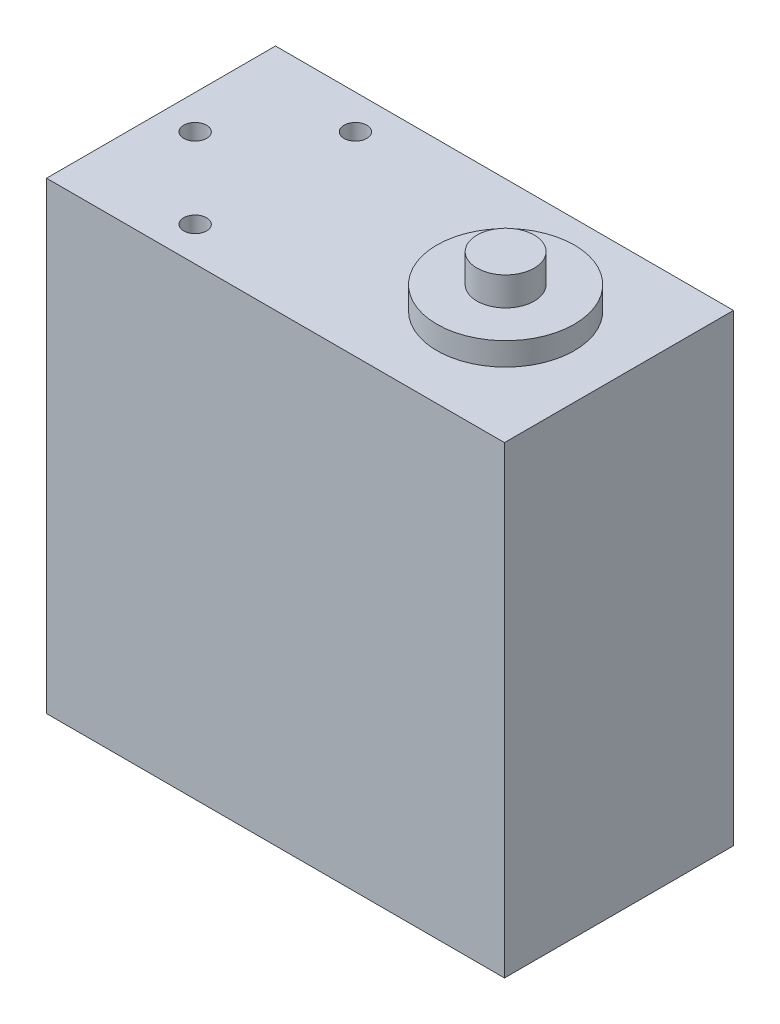
ISO-10303-21;
HEADER;
FILE_DESCRIPTION(('STEP AP214'),'2;1');
FILE_NAME('part.step','',(''),(''),'','','');
FILE_SCHEMA(('AUTOMOTIVE_DESIGN { 1 0 10303 214 1 1 1 1 }'));
ENDSEC;
DATA;
#1=APPLICATION_CONTEXT('core data for automotive mechanical design processes');
#2=APPLICATION_PROTOCOL_DEFINITION('international standard','automotive_design',2000,#1);
#3=PRODUCT_CONTEXT('',#1,'mechanical');
#4=PRODUCT('Part','Part','',(#3));
#5=PRODUCT_RELATED_PRODUCT_CATEGORY('part','',(#4));
#6=PRODUCT_DEFINITION_FORMATION('','',#4);
#7=PRODUCT_DEFINITION_CONTEXT('part definition',#1,'design');
#8=PRODUCT_DEFINITION('design','',#6,#7);
#9=PRODUCT_DEFINITION_SHAPE('','',#8);
#10=(LENGTH_UNIT() NAMED_UNIT(*) SI_UNIT(.MILLI.,.METRE.));
#11=(NAMED_UNIT(*) PLANE_ANGLE_UNIT() SI_UNIT($,.RADIAN.));
#12=(NAMED_UNIT(*) SI_UNIT($,.STERADIAN.) SOLID_ANGLE_UNIT());
#13=UNCERTAINTY_MEASURE_WITH_UNIT(LENGTH_MEASURE(1.E-05),#10,'distance_accuracy_value','');
#14=(GEOMETRIC_REPRESENTATION_CONTEXT(3) GLOBAL_UNCERTAINTY_ASSIGNED_CONTEXT((#13)) GLOBAL_UNIT_ASSIGNED_CONTEXT((#10,
#11,#12)) REPRESENTATION_CONTEXT('',''));
#15=CARTESIAN_POINT('',(0.,0.,0.));
#16=DIRECTION('',(0.,0.,1.));
#17=DIRECTION('',(1.,0.,0.));
#18=AXIS2_PLACEMENT_3D('',#15,#16,#17);
#19=CARTESIAN_POINT('',(0.,0.,20.));
#20=DIRECTION('',(1.,0.,0.));
#21=DIRECTION('',(0.,0.,-1.));
#22=AXIS2_PLACEMENT_3D('',#19,#20,#21);
#23=PLANE('',#22);
#24=DIRECTION('',(0.,-1.,0.));
#25=VECTOR('',#24,1.);
#26=CARTESIAN_POINT('',(0.,0.,0.));
#27=LINE('',#26,#25);
#28=CARTESIAN_POINT('',(0.,40.5,0.));
#29=VERTEX_POINT('',#28);
#30=CARTESIAN_POINT('',(0.,0.,0.));
#31=VERTEX_POINT('',#30);
#32=EDGE_CURVE('E113',#29,#31,#27,.T.);
#33=ORIENTED_EDGE('',*,*,#32,.T.);
#34=DIRECTION('',(0.,0.,-1.));
#35=VECTOR('',#34,1.);
#36=CARTESIAN_POINT('',(0.,0.,20.));
#37=LINE('',#36,#35);
#38=CARTESIAN_POINT('',(0.,0.,20.));
#39=VERTEX_POINT('',#38);
#40=EDGE_CURVE('E51',#39,#31,#37,.T.);
#41=ORIENTED_EDGE('',*,*,#40,.F.);
#42=DIRECTION('',(0.,-1.,0.));
#43=VECTOR('',#42,1.);
#44=CARTESIAN_POINT('',(0.,0.,20.));
#45=LINE('',#44,#43);
#46=CARTESIAN_POINT('',(0.,40.5,20.));
#47=VERTEX_POINT('',#46);
#48=EDGE_CURVE('E95',#47,#39,#45,.T.);
#49=ORIENTED_EDGE('',*,*,#48,.F.);
#50=DIRECTION('',(0.,0.,-1.));
#51=VECTOR('',#50,1.);
#52=CARTESIAN_POINT('',(0.,40.5,20.));
#53=LINE('',#52,#51);
#54=EDGE_CURVE('E109',#47,#29,#53,.T.);
#55=ORIENTED_EDGE('',*,*,#54,.T.);
#56=EDGE_LOOP('',(#33,#41,#49,#55));
#57=FACE_BOUND('',#56,.T.);
#58=ADVANCED_FACE('F42',(#57),#23,.F.);
#59=CARTESIAN_POINT('',(0.,0.,20.));
#60=DIRECTION('',(0.,1.,0.));
#61=DIRECTION('',(0.,0.,1.));
#62=AXIS2_PLACEMENT_3D('',#59,#60,#61);
#63=PLANE('',#62);
#64=CARTESIAN_POINT('',(17.5,0.,17.5));
#65=DIRECTION('',(0.,-1.,0.));
#66=DIRECTION('',(0.,0.,-1.));
#67=AXIS2_PLACEMENT_3D('',#64,#65,#66);
#68=CIRCLE('',#67,1.);
#69=CARTESIAN_POINT('',(17.5,0.,16.5));
#70=VERTEX_POINT('',#69);
#71=EDGE_CURVE('E309',#70,#70,#68,.T.);
#72=ORIENTED_EDGE('',*,*,#71,.F.);
#73=EDGE_LOOP('',(#72));
#74=FACE_BOUND('',#73,.T.);
#75=CARTESIAN_POINT('',(17.5000000000002,0.,2.5));
#76=DIRECTION('',(0.,-1.,0.));
#77=DIRECTION('',(0.,0.,-1.));
#78=AXIS2_PLACEMENT_3D('',#75,#76,#77);
#79=CIRCLE('',#78,1.);
#80=CARTESIAN_POINT('',(17.5000000000002,0.,1.5));
#81=VERTEX_POINT('',#80);
#82=EDGE_CURVE('E323',#81,#81,#79,.T.);
#83=ORIENTED_EDGE('',*,*,#82,.F.);
#84=EDGE_LOOP('',(#83));
#85=FACE_BOUND('',#84,.T.);
#86=CARTESIAN_POINT('',(2.50000000000016,0.,2.5));
#87=DIRECTION('',(0.,-1.,0.));
#88=DIRECTION('',(0.,0.,-1.));
#89=AXIS2_PLACEMENT_3D('',#86,#87,#88);
#90=CIRCLE('',#89,1.);
#91=CARTESIAN_POINT('',(2.50000000000016,0.,1.5));
#92=VERTEX_POINT('',#91);
#93=EDGE_CURVE('E331',#92,#92,#90,.T.);
#94=ORIENTED_EDGE('',*,*,#93,.F.);
#95=EDGE_LOOP('',(#94));
#96=FACE_BOUND('',#95,.T.);
#97=CARTESIAN_POINT('',(2.5,0.,17.5));
#98=DIRECTION('',(0.,-1.,0.));
#99=DIRECTION('',(0.,0.,-1.));
#100=AXIS2_PLACEMENT_3D('',#97,#98,#99);
#101=CIRCLE('',#100,1.);
#102=CARTESIAN_POINT('',(2.5,0.,16.5));
#103=VERTEX_POINT('',#102);
#104=EDGE_CURVE('E308',#103,#103,#101,.T.);
#105=ORIENTED_EDGE('',*,*,#104,.F.);
#106=EDGE_LOOP('',(#105));
#107=FACE_BOUND('',#106,.T.);
#108=CARTESIAN_POINT('',(30.1,0.,10.));
#109=DIRECTION('',(0.,1.,0.));
#110=DIRECTION('',(0.,0.,1.));
#111=AXIS2_PLACEMENT_3D('',#108,#109,#110);
#112=CIRCLE('',#111,6.);
#113=CARTESIAN_POINT('',(30.1,0.,16.));
#114=VERTEX_POINT('',#113);
#115=EDGE_CURVE('E200',#114,#114,#112,.T.);
#116=ORIENTED_EDGE('',*,*,#115,.T.);
#117=EDGE_LOOP('',(#116));
#118=FACE_BOUND('',#117,.T.);
#119=DIRECTION('',(1.,0.,0.));
#120=VECTOR('',#119,1.);
#121=CARTESIAN_POINT('',(0.,0.,0.));
#122=LINE('',#121,#120);
#123=CARTESIAN_POINT('',(40.,0.,0.));
#124=VERTEX_POINT('',#123);
#125=EDGE_CURVE('E101',#31,#124,#122,.T.);
#126=ORIENTED_EDGE('',*,*,#125,.T.);
#127=DIRECTION('',(0.,0.,-1.));
#128=VECTOR('',#127,1.);
#129=CARTESIAN_POINT('',(40.,0.,20.));
#130=LINE('',#129,#128);
#131=CARTESIAN_POINT('',(40.,0.,20.));
#132=VERTEX_POINT('',#131);
#133=EDGE_CURVE('E99',#132,#124,#130,.T.);
#134=ORIENTED_EDGE('',*,*,#133,.F.);
#135=DIRECTION('',(1.,0.,0.));
#136=VECTOR('',#135,1.);
#137=CARTESIAN_POINT('',(0.,0.,20.));
#138=LINE('',#137,#136);
#139=EDGE_CURVE('E90',#39,#132,#138,.T.);
#140=ORIENTED_EDGE('',*,*,#139,.F.);
#141=ORIENTED_EDGE('',*,*,#40,.T.);
#142=EDGE_LOOP('',(#126,#134,#140,#141));
#143=FACE_BOUND('',#142,.T.);
#144=ADVANCED_FACE('F100',(#74,#85,#96,#107,#118,#143),#63,.F.);
#145=CARTESIAN_POINT('',(40.,0.,20.));
#146=DIRECTION('',(-1.,0.,0.));
#147=DIRECTION('',(0.,0.,1.));
#148=AXIS2_PLACEMENT_3D('',#145,#146,#147);
#149=PLANE('',#148);
#150=DIRECTION('',(0.,1.,0.));
#151=VECTOR('',#150,1.);
#152=CARTESIAN_POINT('',(40.,0.,0.));
#153=LINE('',#152,#151);
#154=CARTESIAN_POINT('',(40.,40.5,0.));
#155=VERTEX_POINT('',#154);
#156=EDGE_CURVE('E76',#124,#155,#153,.T.);
#157=ORIENTED_EDGE('',*,*,#156,.T.);
#158=DIRECTION('',(0.,0.,-1.));
#159=VECTOR('',#158,1.);
#160=CARTESIAN_POINT('',(40.,40.5,20.));
#161=LINE('',#160,#159);
#162=CARTESIAN_POINT('',(40.,40.5,20.));
#163=VERTEX_POINT('',#162);
#164=EDGE_CURVE('E103',#163,#155,#161,.T.);
#165=ORIENTED_EDGE('',*,*,#164,.F.);
#166=DIRECTION('',(0.,1.,0.));
#167=VECTOR('',#166,1.);
#168=CARTESIAN_POINT('',(40.,0.,20.));
#169=LINE('',#168,#167);
#170=EDGE_CURVE('E93',#132,#163,#169,.T.);
#171=ORIENTED_EDGE('',*,*,#170,.F.);
#172=ORIENTED_EDGE('',*,*,#133,.T.);
#173=EDGE_LOOP('',(#157,#165,#171,#172));
#174=FACE_BOUND('',#173,.T.);
#175=ADVANCED_FACE('F105',(#174),#149,.F.);
#176=CARTESIAN_POINT('',(0.,40.5,20.));
#177=DIRECTION('',(0.,-1.,0.));
#178=DIRECTION('',(0.,0.,-1.));
#179=AXIS2_PLACEMENT_3D('',#176,#177,#178);
#180=PLANE('',#179);
#181=CARTESIAN_POINT('',(9.98000000000015,40.5,17.));
#182=DIRECTION('',(0.,1.,0.));
#183=DIRECTION('',(0.,0.,1.));
#184=AXIS2_PLACEMENT_3D('',#181,#182,#183);
#185=CIRCLE('',#184,1.);
#186=CARTESIAN_POINT('',(9.98000000000015,40.5,18.));
#187=VERTEX_POINT('',#186);
#188=EDGE_CURVE('E163',#187,#187,#185,.T.);
#189=ORIENTED_EDGE('',*,*,#188,.F.);
#190=EDGE_LOOP('',(#189));
#191=FACE_BOUND('',#190,.T.);
#192=CARTESIAN_POINT('',(2.98,40.5,10.));
#193=DIRECTION('',(0.,1.,0.));
#194=DIRECTION('',(0.,0.,1.));
#195=AXIS2_PLACEMENT_3D('',#192,#193,#194);
#196=CIRCLE('',#195,0.999999999999999);
#197=CARTESIAN_POINT('',(2.98,40.5,11.));
#198=VERTEX_POINT('',#197);
#199=EDGE_CURVE('E167',#198,#198,#196,.T.);
#200=ORIENTED_EDGE('',*,*,#199,.F.);
#201=EDGE_LOOP('',(#200));
#202=FACE_BOUND('',#201,.T.);
#203=CARTESIAN_POINT('',(9.98,40.5,3.));
#204=DIRECTION('',(0.,1.,0.));
#205=DIRECTION('',(0.,0.,1.));
#206=AXIS2_PLACEMENT_3D('',#203,#204,#205);
#207=CIRCLE('',#206,1.);
#208=CARTESIAN_POINT('',(9.98,40.5,4.));
#209=VERTEX_POINT('',#208);
#210=EDGE_CURVE('E171',#209,#209,#207,.T.);
#211=ORIENTED_EDGE('',*,*,#210,.F.);
#212=EDGE_LOOP('',(#211));
#213=FACE_BOUND('',#212,.T.);
#214=CARTESIAN_POINT('',(30.1,40.5,10.));
#215=DIRECTION('',(0.,-1.,0.));
#216=DIRECTION('',(0.,0.,-1.));
#217=AXIS2_PLACEMENT_3D('',#214,#215,#216);
#218=CIRCLE('',#217,6.);
#219=CARTESIAN_POINT('',(30.1,40.5,4.));
#220=VERTEX_POINT('',#219);
#221=EDGE_CURVE('E11',#220,#220,#218,.F.);
#222=ORIENTED_EDGE('',*,*,#221,.F.);
#223=EDGE_LOOP('',(#222));
#224=FACE_BOUND('',#223,.T.);
#225=DIRECTION('',(-1.,0.,0.));
#226=VECTOR('',#225,1.);
#227=CARTESIAN_POINT('',(0.,40.5,0.));
#228=LINE('',#227,#226);
#229=EDGE_CURVE('E82',#155,#29,#228,.T.);
#230=ORIENTED_EDGE('',*,*,#229,.T.);
#231=ORIENTED_EDGE('',*,*,#54,.F.);
#232=DIRECTION('',(-1.,0.,0.));
#233=VECTOR('',#232,1.);
#234=CARTESIAN_POINT('',(0.,40.5,20.));
#235=LINE('',#234,#233);
#236=EDGE_CURVE('E59',#163,#47,#235,.T.);
#237=ORIENTED_EDGE('',*,*,#236,.F.);
#238=ORIENTED_EDGE('',*,*,#164,.T.);
#239=EDGE_LOOP('',(#230,#231,#237,#238));
#240=FACE_BOUND('',#239,.T.);
#241=ADVANCED_FACE('F142',(#191,#202,#213,#224,#240),#180,.F.);
#242=CARTESIAN_POINT('',(0.,0.,20.));
#243=DIRECTION('',(0.,0.,-1.));
#244=DIRECTION('',(-1.,0.,0.));
#245=AXIS2_PLACEMENT_3D('',#242,#243,#244);
#246=PLANE('',#245);
#247=ORIENTED_EDGE('',*,*,#48,.T.);
#248=ORIENTED_EDGE('',*,*,#139,.T.);
#249=ORIENTED_EDGE('',*,*,#170,.T.);
#250=ORIENTED_EDGE('',*,*,#236,.T.);
#251=EDGE_LOOP('',(#247,#248,#249,#250));
#252=FACE_BOUND('',#251,.T.);
#253=ADVANCED_FACE('F91',(#252),#246,.F.);
#254=CARTESIAN_POINT('',(0.,0.,0.));
#255=DIRECTION('',(0.,0.,-1.));
#256=DIRECTION('',(-1.,0.,0.));
#257=AXIS2_PLACEMENT_3D('',#254,#255,#256);
#258=PLANE('',#257);
#259=ORIENTED_EDGE('',*,*,#32,.F.);
#260=ORIENTED_EDGE('',*,*,#229,.F.);
#261=ORIENTED_EDGE('',*,*,#156,.F.);
#262=ORIENTED_EDGE('',*,*,#125,.F.);
#263=EDGE_LOOP('',(#259,#260,#261,#262));
#264=FACE_BOUND('',#263,.T.);
#265=ADVANCED_FACE('F131',(#264),#258,.T.);
#266=CARTESIAN_POINT('',(30.1,42.5,10.));
#267=DIRECTION('',(0.,-1.,0.));
#268=DIRECTION('',(0.,0.,-1.));
#269=AXIS2_PLACEMENT_3D('',#266,#267,#268);
#270=CYLINDRICAL_SURFACE('',#269,6.);
#271=CARTESIAN_POINT('',(30.1,42.5,10.));
#272=DIRECTION('',(0.,1.,0.));
#273=DIRECTION('',(0.,0.,1.));
#274=AXIS2_PLACEMENT_3D('',#271,#272,#273);
#275=CIRCLE('',#274,6.);
#276=CARTESIAN_POINT('',(30.1,42.5,16.));
#277=VERTEX_POINT('',#276);
#278=EDGE_CURVE('E117',#277,#277,#275,.T.);
#279=ORIENTED_EDGE('',*,*,#278,.F.);
#280=EDGE_LOOP('',(#279));
#281=FACE_BOUND('',#280,.T.);
#282=ORIENTED_EDGE('',*,*,#221,.T.);
#283=EDGE_LOOP('',(#282));
#284=FACE_BOUND('',#283,.T.);
#285=ADVANCED_FACE('F133',(#281,#284),#270,.T.);
#286=CARTESIAN_POINT('',(30.1,42.5,10.));
#287=DIRECTION('',(0.,1.,0.));
#288=DIRECTION('',(0.,0.,1.));
#289=AXIS2_PLACEMENT_3D('',#286,#287,#288);
#290=PLANE('',#289);
#291=CARTESIAN_POINT('',(30.1,42.5,10.));
#292=DIRECTION('',(0.,1.,0.));
#293=DIRECTION('',(0.,0.,1.));
#294=AXIS2_PLACEMENT_3D('',#291,#292,#293);
#295=CIRCLE('',#294,2.5);
#296=CARTESIAN_POINT('',(30.1,42.5,12.5));
#297=VERTEX_POINT('',#296);
#298=EDGE_CURVE('E192',#297,#297,#295,.T.);
#299=ORIENTED_EDGE('',*,*,#298,.F.);
#300=EDGE_LOOP('',(#299));
#301=FACE_BOUND('',#300,.T.);
#302=ORIENTED_EDGE('',*,*,#278,.T.);
#303=EDGE_LOOP('',(#302));
#304=FACE_BOUND('',#303,.T.);
#305=ADVANCED_FACE('F139',(#301,#304),#290,.T.);
#306=CARTESIAN_POINT('',(30.1,-2.,10.));
#307=DIRECTION('',(0.,1.,0.));
#308=DIRECTION('',(0.,0.,1.));
#309=AXIS2_PLACEMENT_3D('',#306,#307,#308);
#310=CYLINDRICAL_SURFACE('',#309,6.);
#311=CARTESIAN_POINT('',(30.1,-2.,10.));
#312=DIRECTION('',(0.,1.,0.));
#313=DIRECTION('',(0.,0.,1.));
#314=AXIS2_PLACEMENT_3D('',#311,#312,#313);
#315=CIRCLE('',#314,6.);
#316=CARTESIAN_POINT('',(30.1,-2.,16.));
#317=VERTEX_POINT('',#316);
#318=EDGE_CURVE('E204',#317,#317,#315,.T.);
#319=ORIENTED_EDGE('',*,*,#318,.T.);
#320=EDGE_LOOP('',(#319));
#321=FACE_BOUND('',#320,.T.);
#322=ORIENTED_EDGE('',*,*,#115,.F.);
#323=EDGE_LOOP('',(#322));
#324=FACE_BOUND('',#323,.T.);
#325=ADVANCED_FACE('F217',(#321,#324),#310,.T.);
#326=CARTESIAN_POINT('',(30.1,-2.,10.));
#327=DIRECTION('',(0.,-1.,0.));
#328=DIRECTION('',(0.,0.,1.));
#329=AXIS2_PLACEMENT_3D('',#326,#327,#328);
#330=PLANE('',#329);
#331=CARTESIAN_POINT('',(30.1,-2.,10.));
#332=DIRECTION('',(0.,-1.,0.));
#333=DIRECTION('',(0.,0.,-1.));
#334=AXIS2_PLACEMENT_3D('',#331,#332,#333);
#335=CIRCLE('',#334,2.5);
#336=CARTESIAN_POINT('',(30.1,-2.,7.5));
#337=VERTEX_POINT('',#336);
#338=EDGE_CURVE('E182',#337,#337,#335,.T.);
#339=ORIENTED_EDGE('',*,*,#338,.F.);
#340=EDGE_LOOP('',(#339));
#341=FACE_BOUND('',#340,.T.);
#342=ORIENTED_EDGE('',*,*,#318,.F.);
#343=EDGE_LOOP('',(#342));
#344=FACE_BOUND('',#343,.T.);
#345=ADVANCED_FACE('F223',(#341,#344),#330,.T.);
#346=CARTESIAN_POINT('',(30.1,45.,10.));
#347=DIRECTION('',(0.,-1.,0.));
#348=DIRECTION('',(0.,0.,-1.));
#349=AXIS2_PLACEMENT_3D('',#346,#347,#348);
#350=CYLINDRICAL_SURFACE('',#349,2.5);
#351=CARTESIAN_POINT('',(30.1,45.,10.));
#352=DIRECTION('',(0.,1.,0.));
#353=DIRECTION('',(0.,0.,1.));
#354=AXIS2_PLACEMENT_3D('',#351,#352,#353);
#355=CIRCLE('',#354,2.5);
#356=CARTESIAN_POINT('',(30.1,45.,12.5));
#357=VERTEX_POINT('',#356);
#358=EDGE_CURVE('E196',#357,#357,#355,.T.);
#359=ORIENTED_EDGE('',*,*,#358,.F.);
#360=EDGE_LOOP('',(#359));
#361=FACE_BOUND('',#360,.T.);
#362=ORIENTED_EDGE('',*,*,#298,.T.);
#363=EDGE_LOOP('',(#362));
#364=FACE_BOUND('',#363,.T.);
#365=ADVANCED_FACE('F230',(#361,#364),#350,.T.);
#366=CARTESIAN_POINT('',(30.1,45.,10.));
#367=DIRECTION('',(0.,1.,0.));
#368=DIRECTION('',(0.,0.,1.));
#369=AXIS2_PLACEMENT_3D('',#366,#367,#368);
#370=PLANE('',#369);
#371=ORIENTED_EDGE('',*,*,#358,.T.);
#372=EDGE_LOOP('',(#371));
#373=FACE_BOUND('',#372,.T.);
#374=ADVANCED_FACE('F234',(#373),#370,.T.);
#375=CARTESIAN_POINT('',(30.1,-4.5,10.));
#376=DIRECTION('',(0.,1.,0.));
#377=DIRECTION('',(0.,0.,1.));
#378=AXIS2_PLACEMENT_3D('',#375,#376,#377);
#379=CYLINDRICAL_SURFACE('',#378,2.5);
#380=CARTESIAN_POINT('',(30.1,-4.5,10.));
#381=DIRECTION('',(0.,-1.,0.));
#382=DIRECTION('',(0.,0.,-1.));
#383=AXIS2_PLACEMENT_3D('',#380,#381,#382);
#384=CIRCLE('',#383,2.5);
#385=CARTESIAN_POINT('',(30.1,-4.5,7.5));
#386=VERTEX_POINT('',#385);
#387=EDGE_CURVE('E188',#386,#386,#384,.T.);
#388=ORIENTED_EDGE('',*,*,#387,.F.);
#389=EDGE_LOOP('',(#388));
#390=FACE_BOUND('',#389,.T.);
#391=ORIENTED_EDGE('',*,*,#338,.T.);
#392=EDGE_LOOP('',(#391));
#393=FACE_BOUND('',#392,.T.);
#394=ADVANCED_FACE('F238',(#390,#393),#379,.T.);
#395=CARTESIAN_POINT('',(30.1,-4.5,10.));
#396=DIRECTION('',(0.,-1.,0.));
#397=DIRECTION('',(0.,0.,-1.));
#398=AXIS2_PLACEMENT_3D('',#395,#396,#397);
#399=PLANE('',#398);
#400=ORIENTED_EDGE('',*,*,#387,.T.);
#401=EDGE_LOOP('',(#400));
#402=FACE_BOUND('',#401,.T.);
#403=ADVANCED_FACE('F242',(#402),#399,.T.);
#404=CARTESIAN_POINT('',(9.98,38.,3.));
#405=DIRECTION('',(0.,1.,0.));
#406=DIRECTION('',(0.,0.,1.));
#407=AXIS2_PLACEMENT_3D('',#404,#405,#406);
#408=CYLINDRICAL_SURFACE('',#407,1.);
#409=CARTESIAN_POINT('',(9.98,38.,3.));
#410=DIRECTION('',(0.,1.,0.));
#411=DIRECTION('',(0.,0.,1.));
#412=AXIS2_PLACEMENT_3D('',#409,#410,#411);
#413=CIRCLE('',#412,1.);
#414=CARTESIAN_POINT('',(9.98,38.,4.));
#415=VERTEX_POINT('',#414);
#416=EDGE_CURVE('E176',#415,#415,#413,.T.);
#417=ORIENTED_EDGE('',*,*,#416,.F.);
#418=EDGE_LOOP('',(#417));
#419=FACE_BOUND('',#418,.T.);
#420=ORIENTED_EDGE('',*,*,#210,.T.);
#421=EDGE_LOOP('',(#420));
#422=FACE_BOUND('',#421,.T.);
#423=ADVANCED_FACE('F246',(#419,#422),#408,.F.);
#424=CARTESIAN_POINT('',(9.98,38.,3.));
#425=DIRECTION('',(0.,1.,0.));
#426=DIRECTION('',(0.,0.,1.));
#427=AXIS2_PLACEMENT_3D('',#424,#425,#426);
#428=PLANE('',#427);
#429=ORIENTED_EDGE('',*,*,#416,.T.);
#430=EDGE_LOOP('',(#429));
#431=FACE_BOUND('',#430,.T.);
#432=ADVANCED_FACE('F250',(#431),#428,.T.);
#433=CARTESIAN_POINT('',(2.98,38.,10.));
#434=DIRECTION('',(0.,1.,0.));
#435=DIRECTION('',(0.,0.,1.));
#436=AXIS2_PLACEMENT_3D('',#433,#434,#435);
#437=CYLINDRICAL_SURFACE('',#436,0.999999999999999);
#438=CARTESIAN_POINT('',(2.98,38.,10.));
#439=DIRECTION('',(0.,1.,0.));
#440=DIRECTION('',(0.,0.,1.));
#441=AXIS2_PLACEMENT_3D('',#438,#439,#440);
#442=CIRCLE('',#441,0.999999999999999);
#443=CARTESIAN_POINT('',(2.98,38.,11.));
#444=VERTEX_POINT('',#443);
#445=EDGE_CURVE('E340',#444,#444,#442,.T.);
#446=ORIENTED_EDGE('',*,*,#445,.F.);
#447=EDGE_LOOP('',(#446));
#448=FACE_BOUND('',#447,.T.);
#449=ORIENTED_EDGE('',*,*,#199,.T.);
#450=EDGE_LOOP('',(#449));
#451=FACE_BOUND('',#450,.T.);
#452=ADVANCED_FACE('F254',(#448,#451),#437,.F.);
#453=CARTESIAN_POINT('',(2.98,38.,10.));
#454=DIRECTION('',(0.,1.,0.));
#455=DIRECTION('',(0.,0.,1.));
#456=AXIS2_PLACEMENT_3D('',#453,#454,#455);
#457=PLANE('',#456);
#458=ORIENTED_EDGE('',*,*,#445,.T.);
#459=EDGE_LOOP('',(#458));
#460=FACE_BOUND('',#459,.T.);
#461=ADVANCED_FACE('F258',(#460),#457,.T.);
#462=CARTESIAN_POINT('',(9.98000000000015,38.,17.));
#463=DIRECTION('',(0.,1.,0.));
#464=DIRECTION('',(0.,0.,1.));
#465=AXIS2_PLACEMENT_3D('',#462,#463,#464);
#466=CYLINDRICAL_SURFACE('',#465,1.);
#467=CARTESIAN_POINT('',(9.98000000000015,38.,17.));
#468=DIRECTION('',(0.,1.,0.));
#469=DIRECTION('',(0.,0.,1.));
#470=AXIS2_PLACEMENT_3D('',#467,#468,#469);
#471=CIRCLE('',#470,1.);
#472=CARTESIAN_POINT('',(9.98000000000015,38.,18.));
#473=VERTEX_POINT('',#472);
#474=EDGE_CURVE('E177',#473,#473,#471,.T.);
#475=ORIENTED_EDGE('',*,*,#474,.F.);
#476=EDGE_LOOP('',(#475));
#477=FACE_BOUND('',#476,.T.);
#478=ORIENTED_EDGE('',*,*,#188,.T.);
#479=EDGE_LOOP('',(#478));
#480=FACE_BOUND('',#479,.T.);
#481=ADVANCED_FACE('F262',(#477,#480),#466,.F.);
#482=CARTESIAN_POINT('',(9.98000000000015,38.,17.));
#483=DIRECTION('',(0.,1.,0.));
#484=DIRECTION('',(0.,0.,1.));
#485=AXIS2_PLACEMENT_3D('',#482,#483,#484);
#486=PLANE('',#485);
#487=ORIENTED_EDGE('',*,*,#474,.T.);
#488=EDGE_LOOP('',(#487));
#489=FACE_BOUND('',#488,.T.);
#490=ADVANCED_FACE('F266',(#489),#486,.T.);
#491=CARTESIAN_POINT('',(2.5,2.5,17.5));
#492=DIRECTION('',(0.,-1.,0.));
#493=DIRECTION('',(0.,0.,-1.));
#494=AXIS2_PLACEMENT_3D('',#491,#492,#493);
#495=CYLINDRICAL_SURFACE('',#494,1.);
#496=CARTESIAN_POINT('',(2.5,2.5,17.5));
#497=DIRECTION('',(0.,-1.,0.));
#498=DIRECTION('',(0.,0.,-1.));
#499=AXIS2_PLACEMENT_3D('',#496,#497,#498);
#500=CIRCLE('',#499,1.);
#501=CARTESIAN_POINT('',(2.5,2.5,16.5));
#502=VERTEX_POINT('',#501);
#503=EDGE_CURVE('E314',#502,#502,#500,.T.);
#504=ORIENTED_EDGE('',*,*,#503,.F.);
#505=EDGE_LOOP('',(#504));
#506=FACE_BOUND('',#505,.T.);
#507=ORIENTED_EDGE('',*,*,#104,.T.);
#508=EDGE_LOOP('',(#507));
#509=FACE_BOUND('',#508,.T.);
#510=ADVANCED_FACE('F270',(#506,#509),#495,.F.);
#511=CARTESIAN_POINT('',(2.5,2.5,17.5));
#512=DIRECTION('',(0.,-1.,0.));
#513=DIRECTION('',(0.,0.,-1.));
#514=AXIS2_PLACEMENT_3D('',#511,#512,#513);
#515=PLANE('',#514);
#516=ORIENTED_EDGE('',*,*,#503,.T.);
#517=EDGE_LOOP('',(#516));
#518=FACE_BOUND('',#517,.T.);
#519=ADVANCED_FACE('F274',(#518),#515,.T.);
#520=CARTESIAN_POINT('',(2.50000000000016,2.5,2.5));
#521=DIRECTION('',(0.,-1.,0.));
#522=DIRECTION('',(0.,0.,-1.));
#523=AXIS2_PLACEMENT_3D('',#520,#521,#522);
#524=CYLINDRICAL_SURFACE('',#523,1.);
#525=CARTESIAN_POINT('',(2.50000000000016,2.5,2.5));
#526=DIRECTION('',(0.,-1.,0.));
#527=DIRECTION('',(0.,0.,-1.));
#528=AXIS2_PLACEMENT_3D('',#525,#526,#527);
#529=CIRCLE('',#528,1.);
#530=CARTESIAN_POINT('',(2.50000000000016,2.5,1.5));
#531=VERTEX_POINT('',#530);
#532=EDGE_CURVE('E327',#531,#531,#529,.T.);
#533=ORIENTED_EDGE('',*,*,#532,.F.);
#534=EDGE_LOOP('',(#533));
#535=FACE_BOUND('',#534,.T.);
#536=ORIENTED_EDGE('',*,*,#93,.T.);
#537=EDGE_LOOP('',(#536));
#538=FACE_BOUND('',#537,.T.);
#539=ADVANCED_FACE('F278',(#535,#538),#524,.F.);
#540=CARTESIAN_POINT('',(2.50000000000016,2.5,2.5));
#541=DIRECTION('',(0.,-1.,0.));
#542=DIRECTION('',(0.,0.,-1.));
#543=AXIS2_PLACEMENT_3D('',#540,#541,#542);
#544=PLANE('',#543);
#545=ORIENTED_EDGE('',*,*,#532,.T.);
#546=EDGE_LOOP('',(#545));
#547=FACE_BOUND('',#546,.T.);
#548=ADVANCED_FACE('F282',(#547),#544,.T.);
#549=CARTESIAN_POINT('',(17.5000000000002,2.5,2.5));
#550=DIRECTION('',(0.,-1.,0.));
#551=DIRECTION('',(0.,0.,-1.));
#552=AXIS2_PLACEMENT_3D('',#549,#550,#551);
#553=CYLINDRICAL_SURFACE('',#552,1.);
#554=CARTESIAN_POINT('',(17.5000000000002,2.5,2.5));
#555=DIRECTION('',(0.,-1.,0.));
#556=DIRECTION('',(0.,0.,-1.));
#557=AXIS2_PLACEMENT_3D('',#554,#555,#556);
#558=CIRCLE('',#557,1.);
#559=CARTESIAN_POINT('',(17.5000000000002,2.5,1.5));
#560=VERTEX_POINT('',#559);
#561=EDGE_CURVE('E317',#560,#560,#558,.T.);
#562=ORIENTED_EDGE('',*,*,#561,.F.);
#563=EDGE_LOOP('',(#562));
#564=FACE_BOUND('',#563,.T.);
#565=ORIENTED_EDGE('',*,*,#82,.T.);
#566=EDGE_LOOP('',(#565));
#567=FACE_BOUND('',#566,.T.);
#568=ADVANCED_FACE('F286',(#564,#567),#553,.F.);
#569=CARTESIAN_POINT('',(17.5000000000002,2.5,2.5));
#570=DIRECTION('',(0.,-1.,0.));
#571=DIRECTION('',(0.,0.,-1.));
#572=AXIS2_PLACEMENT_3D('',#569,#570,#571);
#573=PLANE('',#572);
#574=ORIENTED_EDGE('',*,*,#561,.T.);
#575=EDGE_LOOP('',(#574));
#576=FACE_BOUND('',#575,.T.);
#577=ADVANCED_FACE('F290',(#576),#573,.T.);
#578=CARTESIAN_POINT('',(17.5,2.5,17.5));
#579=DIRECTION('',(0.,-1.,0.));
#580=DIRECTION('',(0.,0.,-1.));
#581=AXIS2_PLACEMENT_3D('',#578,#579,#580);
#582=CYLINDRICAL_SURFACE('',#581,1.);
#583=CARTESIAN_POINT('',(17.5,2.5,17.5));
#584=DIRECTION('',(0.,-1.,0.));
#585=DIRECTION('',(0.,0.,-1.));
#586=AXIS2_PLACEMENT_3D('',#583,#584,#585);
#587=CIRCLE('',#586,1.);
#588=CARTESIAN_POINT('',(17.5,2.5,16.5));
#589=VERTEX_POINT('',#588);
#590=EDGE_CURVE('E306',#589,#589,#587,.T.);
#591=ORIENTED_EDGE('',*,*,#590,.F.);
#592=EDGE_LOOP('',(#591));
#593=FACE_BOUND('',#592,.T.);
#594=ORIENTED_EDGE('',*,*,#71,.T.);
#595=EDGE_LOOP('',(#594));
#596=FACE_BOUND('',#595,.T.);
#597=ADVANCED_FACE('F294',(#593,#596),#582,.F.);
#598=CARTESIAN_POINT('',(17.5,2.5,17.5));
#599=DIRECTION('',(0.,-1.,0.));
#600=DIRECTION('',(0.,0.,-1.));
#601=AXIS2_PLACEMENT_3D('',#598,#599,#600);
#602=PLANE('',#601);
#603=ORIENTED_EDGE('',*,*,#590,.T.);
#604=EDGE_LOOP('',(#603));
#605=FACE_BOUND('',#604,.T.);
#606=ADVANCED_FACE('F298',(#605),#602,.T.);
#607=CLOSED_SHELL('',(#58,#144,#175,#241,#253,#265,#285,#305,#325,#345,#365,#374,#394,#403,#423,
#432,#452,#461,#481,#490,#510,#519,#539,#548,#568,#577,#597,#606));
#608=MANIFOLD_SOLID_BREP('B2',#607);
#609=ADVANCED_BREP_SHAPE_REPRESENTATION('',(#18,#608),#14);
#610=SHAPE_DEFINITION_REPRESENTATION(#9,#609);
ENDSEC;
END-ISO-10303-21;
